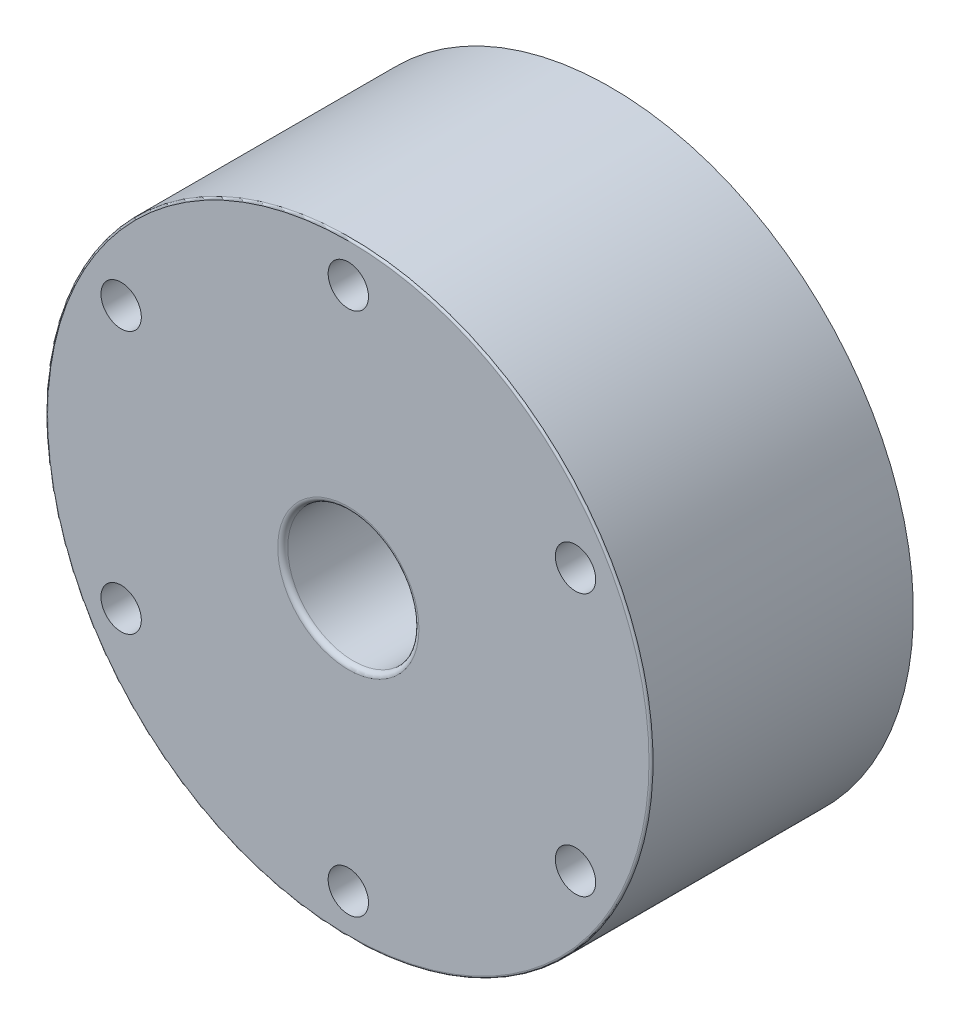
ISO-10303-21;
HEADER;
FILE_DESCRIPTION(('STEP AP214'),'2;1');
FILE_NAME('part.step','',(''),(''),'','','');
FILE_SCHEMA(('AUTOMOTIVE_DESIGN { 1 0 10303 214 1 1 1 1 }'));
ENDSEC;
DATA;
#1=APPLICATION_CONTEXT('core data for automotive mechanical design processes');
#2=APPLICATION_PROTOCOL_DEFINITION('international standard','automotive_design',2000,#1);
#3=PRODUCT_CONTEXT('',#1,'mechanical');
#4=PRODUCT('Part','Part','',(#3));
#5=PRODUCT_RELATED_PRODUCT_CATEGORY('part','',(#4));
#6=PRODUCT_DEFINITION_FORMATION('','',#4);
#7=PRODUCT_DEFINITION_CONTEXT('part definition',#1,'design');
#8=PRODUCT_DEFINITION('design','',#6,#7);
#9=PRODUCT_DEFINITION_SHAPE('','',#8);
#10=(LENGTH_UNIT() NAMED_UNIT(*) SI_UNIT(.MILLI.,.METRE.));
#11=(NAMED_UNIT(*) PLANE_ANGLE_UNIT() SI_UNIT($,.RADIAN.));
#12=(NAMED_UNIT(*) SI_UNIT($,.STERADIAN.) SOLID_ANGLE_UNIT());
#13=UNCERTAINTY_MEASURE_WITH_UNIT(LENGTH_MEASURE(1.E-05),#10,'distance_accuracy_value','');
#14=(GEOMETRIC_REPRESENTATION_CONTEXT(3) GLOBAL_UNCERTAINTY_ASSIGNED_CONTEXT((#13)) GLOBAL_UNIT_ASSIGNED_CONTEXT((#10,
#11,#12)) REPRESENTATION_CONTEXT('',''));
#15=CARTESIAN_POINT('',(0.,0.,0.));
#16=DIRECTION('',(0.,0.,1.));
#17=DIRECTION('',(1.,0.,0.));
#18=AXIS2_PLACEMENT_3D('',#15,#16,#17);
#19=CARTESIAN_POINT('',(0.,0.,0.));
#20=DIRECTION('',(0.,0.,1.));
#21=DIRECTION('',(1.,0.,0.));
#22=AXIS2_PLACEMENT_3D('',#19,#20,#21);
#23=PLANE('',#22);
#24=CARTESIAN_POINT('',(0.,0.,0.));
#25=DIRECTION('',(0.,0.,1.));
#26=DIRECTION('',(1.,0.,0.));
#27=AXIS2_PLACEMENT_3D('',#24,#25,#26);
#28=CIRCLE('',#27,6.5);
#29=CARTESIAN_POINT('',(-6.5,0.,0.));
#30=VERTEX_POINT('',#29);
#31=EDGE_CURVE('E155',#30,#30,#28,.T.);
#32=ORIENTED_EDGE('',*,*,#31,.T.);
#33=EDGE_LOOP('',(#32));
#34=FACE_BOUND('',#33,.T.);
#35=CARTESIAN_POINT('',(0.,0.,0.));
#36=DIRECTION('',(0.,0.,1.));
#37=DIRECTION('',(1.,0.,0.));
#38=AXIS2_PLACEMENT_3D('',#35,#36,#37);
#39=CIRCLE('',#38,30.);
#40=CARTESIAN_POINT('',(-30.,0.,0.));
#41=VERTEX_POINT('',#40);
#42=EDGE_CURVE('E113',#41,#41,#39,.T.);
#43=ORIENTED_EDGE('',*,*,#42,.F.);
#44=EDGE_LOOP('',(#43));
#45=FACE_BOUND('',#44,.T.);
#46=ADVANCED_FACE('F16',(#34,#45),#23,.F.);
#47=CARTESIAN_POINT('',(0.,26.,16.));
#48=DIRECTION('',(0.,0.,1.));
#49=DIRECTION('',(1.,0.,0.));
#50=AXIS2_PLACEMENT_3D('',#47,#48,#49);
#51=PLANE('',#50);
#52=CARTESIAN_POINT('',(0.,26.,16.));
#53=DIRECTION('',(0.,0.,-1.));
#54=DIRECTION('',(1.,0.,0.));
#55=AXIS2_PLACEMENT_3D('',#52,#53,#54);
#56=CIRCLE('',#55,2.);
#57=CARTESIAN_POINT('',(-2.,26.,16.));
#58=VERTEX_POINT('',#57);
#59=EDGE_CURVE('E11',#58,#58,#56,.T.);
#60=ORIENTED_EDGE('',*,*,#59,.F.);
#61=EDGE_LOOP('',(#60));
#62=FACE_BOUND('',#61,.T.);
#63=ADVANCED_FACE('F241',(#62),#51,.T.);
#64=CARTESIAN_POINT('',(0.,26.,26.));
#65=DIRECTION('',(0.,0.,-1.));
#66=DIRECTION('',(1.,0.,0.));
#67=AXIS2_PLACEMENT_3D('',#64,#65,#66);
#68=CYLINDRICAL_SURFACE('',#67,2.);
#69=CARTESIAN_POINT('',(0.,26.,26.));
#70=DIRECTION('',(0.,0.,-1.));
#71=DIRECTION('',(1.,0.,0.));
#72=AXIS2_PLACEMENT_3D('',#69,#70,#71);
#73=CIRCLE('',#72,2.);
#74=CARTESIAN_POINT('',(-2.,26.,26.));
#75=VERTEX_POINT('',#74);
#76=EDGE_CURVE('E117',#75,#75,#73,.T.);
#77=ORIENTED_EDGE('',*,*,#76,.F.);
#78=DIRECTION('',(0.,0.,-1.));
#79=VECTOR('',#78,1.);
#80=CARTESIAN_POINT('',(-2.,26.,26.));
#81=LINE('',#80,#79);
#82=EDGE_CURVE('E27',#75,#58,#81,.T.);
#83=ORIENTED_EDGE('',*,*,#82,.T.);
#84=ORIENTED_EDGE('',*,*,#59,.T.);
#85=ORIENTED_EDGE('',*,*,#82,.F.);
#86=EDGE_LOOP('',(#77,#83,#84,#85));
#87=FACE_BOUND('',#86,.T.);
#88=ADVANCED_FACE('F18',(#87),#68,.F.);
#89=CARTESIAN_POINT('',(22.5166604983954,-13.,16.));
#90=DIRECTION('',(0.,0.,1.));
#91=DIRECTION('',(1.,0.,0.));
#92=AXIS2_PLACEMENT_3D('',#89,#90,#91);
#93=PLANE('',#92);
#94=CARTESIAN_POINT('',(22.5166604983954,-13.,16.));
#95=DIRECTION('',(0.,0.,-1.));
#96=DIRECTION('',(1.,0.,0.));
#97=AXIS2_PLACEMENT_3D('',#94,#95,#96);
#98=CIRCLE('',#97,2.);
#99=CARTESIAN_POINT('',(20.5166604983954,-13.,16.));
#100=VERTEX_POINT('',#99);
#101=EDGE_CURVE('E126',#100,#100,#98,.T.);
#102=ORIENTED_EDGE('',*,*,#101,.F.);
#103=EDGE_LOOP('',(#102));
#104=FACE_BOUND('',#103,.T.);
#105=ADVANCED_FACE('F265',(#104),#93,.T.);
#106=CARTESIAN_POINT('',(22.5166604983954,-13.,26.));
#107=DIRECTION('',(0.,0.,-1.));
#108=DIRECTION('',(1.,0.,0.));
#109=AXIS2_PLACEMENT_3D('',#106,#107,#108);
#110=CYLINDRICAL_SURFACE('',#109,2.);
#111=CARTESIAN_POINT('',(22.5166604983954,-13.,26.));
#112=DIRECTION('',(0.,0.,-1.));
#113=DIRECTION('',(1.,0.,0.));
#114=AXIS2_PLACEMENT_3D('',#111,#112,#113);
#115=CIRCLE('',#114,2.);
#116=CARTESIAN_POINT('',(20.5166604983954,-13.,26.));
#117=VERTEX_POINT('',#116);
#118=EDGE_CURVE('E172',#117,#117,#115,.T.);
#119=ORIENTED_EDGE('',*,*,#118,.F.);
#120=DIRECTION('',(0.,0.,-1.));
#121=VECTOR('',#120,1.);
#122=CARTESIAN_POINT('',(20.5166604983954,-13.,26.));
#123=LINE('',#122,#121);
#124=EDGE_CURVE('E123',#117,#100,#123,.T.);
#125=ORIENTED_EDGE('',*,*,#124,.T.);
#126=ORIENTED_EDGE('',*,*,#101,.T.);
#127=ORIENTED_EDGE('',*,*,#124,.F.);
#128=EDGE_LOOP('',(#119,#125,#126,#127));
#129=FACE_BOUND('',#128,.T.);
#130=ADVANCED_FACE('F236',(#129),#110,.F.);
#131=CARTESIAN_POINT('',(0.,-26.,16.));
#132=DIRECTION('',(0.,0.,1.));
#133=DIRECTION('',(1.,0.,0.));
#134=AXIS2_PLACEMENT_3D('',#131,#132,#133);
#135=PLANE('',#134);
#136=CARTESIAN_POINT('',(0.,-26.,16.));
#137=DIRECTION('',(0.,0.,-1.));
#138=DIRECTION('',(1.,0.,0.));
#139=AXIS2_PLACEMENT_3D('',#136,#137,#138);
#140=CIRCLE('',#139,2.);
#141=CARTESIAN_POINT('',(-2.,-26.,16.));
#142=VERTEX_POINT('',#141);
#143=EDGE_CURVE('E127',#142,#142,#140,.T.);
#144=ORIENTED_EDGE('',*,*,#143,.F.);
#145=EDGE_LOOP('',(#144));
#146=FACE_BOUND('',#145,.T.);
#147=ADVANCED_FACE('F227',(#146),#135,.T.);
#148=CARTESIAN_POINT('',(0.,-26.,26.));
#149=DIRECTION('',(0.,0.,-1.));
#150=DIRECTION('',(1.,0.,0.));
#151=AXIS2_PLACEMENT_3D('',#148,#149,#150);
#152=CYLINDRICAL_SURFACE('',#151,2.);
#153=CARTESIAN_POINT('',(0.,-26.,26.));
#154=DIRECTION('',(0.,0.,-1.));
#155=DIRECTION('',(1.,0.,0.));
#156=AXIS2_PLACEMENT_3D('',#153,#154,#155);
#157=CIRCLE('',#156,2.);
#158=CARTESIAN_POINT('',(-2.,-26.,26.));
#159=VERTEX_POINT('',#158);
#160=EDGE_CURVE('E168',#159,#159,#157,.T.);
#161=ORIENTED_EDGE('',*,*,#160,.F.);
#162=DIRECTION('',(0.,0.,-1.));
#163=VECTOR('',#162,1.);
#164=CARTESIAN_POINT('',(-2.,-26.,26.));
#165=LINE('',#164,#163);
#166=EDGE_CURVE('E135',#159,#142,#165,.T.);
#167=ORIENTED_EDGE('',*,*,#166,.T.);
#168=ORIENTED_EDGE('',*,*,#143,.T.);
#169=ORIENTED_EDGE('',*,*,#166,.F.);
#170=EDGE_LOOP('',(#161,#167,#168,#169));
#171=FACE_BOUND('',#170,.T.);
#172=ADVANCED_FACE('F224',(#171),#152,.F.);
#173=CARTESIAN_POINT('',(-22.5166604983954,13.,16.));
#174=DIRECTION('',(0.,0.,1.));
#175=DIRECTION('',(1.,0.,0.));
#176=AXIS2_PLACEMENT_3D('',#173,#174,#175);
#177=PLANE('',#176);
#178=CARTESIAN_POINT('',(-22.5166604983954,13.,16.));
#179=DIRECTION('',(0.,0.,-1.));
#180=DIRECTION('',(1.,0.,0.));
#181=AXIS2_PLACEMENT_3D('',#178,#179,#180);
#182=CIRCLE('',#181,2.);
#183=CARTESIAN_POINT('',(-24.5166604983954,13.,16.));
#184=VERTEX_POINT('',#183);
#185=EDGE_CURVE('E143',#184,#184,#182,.T.);
#186=ORIENTED_EDGE('',*,*,#185,.F.);
#187=EDGE_LOOP('',(#186));
#188=FACE_BOUND('',#187,.T.);
#189=ADVANCED_FACE('F226',(#188),#177,.T.);
#190=CARTESIAN_POINT('',(-22.5166604983954,13.,26.));
#191=DIRECTION('',(0.,0.,-1.));
#192=DIRECTION('',(1.,0.,0.));
#193=AXIS2_PLACEMENT_3D('',#190,#191,#192);
#194=CYLINDRICAL_SURFACE('',#193,2.);
#195=CARTESIAN_POINT('',(-22.5166604983954,13.,26.));
#196=DIRECTION('',(0.,0.,-1.));
#197=DIRECTION('',(1.,0.,0.));
#198=AXIS2_PLACEMENT_3D('',#195,#196,#197);
#199=CIRCLE('',#198,2.);
#200=CARTESIAN_POINT('',(-24.5166604983954,13.,26.));
#201=VERTEX_POINT('',#200);
#202=EDGE_CURVE('E164',#201,#201,#199,.T.);
#203=ORIENTED_EDGE('',*,*,#202,.F.);
#204=DIRECTION('',(0.,0.,-1.));
#205=VECTOR('',#204,1.);
#206=CARTESIAN_POINT('',(-24.5166604983954,13.,26.));
#207=LINE('',#206,#205);
#208=EDGE_CURVE('E193',#201,#184,#207,.T.);
#209=ORIENTED_EDGE('',*,*,#208,.T.);
#210=ORIENTED_EDGE('',*,*,#185,.T.);
#211=ORIENTED_EDGE('',*,*,#208,.F.);
#212=EDGE_LOOP('',(#203,#209,#210,#211));
#213=FACE_BOUND('',#212,.T.);
#214=ADVANCED_FACE('F191',(#213),#194,.F.);
#215=CARTESIAN_POINT('',(22.5166604983954,13.,16.));
#216=DIRECTION('',(0.,0.,1.));
#217=DIRECTION('',(1.,0.,0.));
#218=AXIS2_PLACEMENT_3D('',#215,#216,#217);
#219=PLANE('',#218);
#220=CARTESIAN_POINT('',(22.5166604983954,13.,16.));
#221=DIRECTION('',(0.,0.,-1.));
#222=DIRECTION('',(1.,0.,0.));
#223=AXIS2_PLACEMENT_3D('',#220,#221,#222);
#224=CIRCLE('',#223,2.);
#225=CARTESIAN_POINT('',(20.5166604983954,13.,16.));
#226=VERTEX_POINT('',#225);
#227=EDGE_CURVE('E110',#226,#226,#224,.T.);
#228=ORIENTED_EDGE('',*,*,#227,.F.);
#229=EDGE_LOOP('',(#228));
#230=FACE_BOUND('',#229,.T.);
#231=ADVANCED_FACE('F257',(#230),#219,.T.);
#232=CARTESIAN_POINT('',(22.5166604983954,13.,26.));
#233=DIRECTION('',(0.,0.,-1.));
#234=DIRECTION('',(1.,0.,0.));
#235=AXIS2_PLACEMENT_3D('',#232,#233,#234);
#236=CYLINDRICAL_SURFACE('',#235,2.);
#237=CARTESIAN_POINT('',(22.5166604983954,13.,26.));
#238=DIRECTION('',(0.,0.,-1.));
#239=DIRECTION('',(1.,0.,0.));
#240=AXIS2_PLACEMENT_3D('',#237,#238,#239);
#241=CIRCLE('',#240,2.);
#242=CARTESIAN_POINT('',(20.5166604983954,13.,26.));
#243=VERTEX_POINT('',#242);
#244=EDGE_CURVE('E160',#243,#243,#241,.T.);
#245=ORIENTED_EDGE('',*,*,#244,.F.);
#246=DIRECTION('',(0.,0.,-1.));
#247=VECTOR('',#246,1.);
#248=CARTESIAN_POINT('',(20.5166604983954,13.,26.));
#249=LINE('',#248,#247);
#250=EDGE_CURVE('E103',#243,#226,#249,.T.);
#251=ORIENTED_EDGE('',*,*,#250,.T.);
#252=ORIENTED_EDGE('',*,*,#227,.T.);
#253=ORIENTED_EDGE('',*,*,#250,.F.);
#254=EDGE_LOOP('',(#245,#251,#252,#253));
#255=FACE_BOUND('',#254,.T.);
#256=ADVANCED_FACE('F254',(#255),#236,.F.);
#257=CARTESIAN_POINT('',(-22.5166604983954,-13.,16.));
#258=DIRECTION('',(0.,0.,1.));
#259=DIRECTION('',(1.,0.,0.));
#260=AXIS2_PLACEMENT_3D('',#257,#258,#259);
#261=PLANE('',#260);
#262=CARTESIAN_POINT('',(-22.5166604983954,-13.,16.));
#263=DIRECTION('',(0.,0.,-1.));
#264=DIRECTION('',(1.,0.,0.));
#265=AXIS2_PLACEMENT_3D('',#262,#263,#264);
#266=CIRCLE('',#265,2.);
#267=CARTESIAN_POINT('',(-24.5166604983954,-13.,16.));
#268=VERTEX_POINT('',#267);
#269=EDGE_CURVE('E96',#268,#268,#266,.T.);
#270=ORIENTED_EDGE('',*,*,#269,.F.);
#271=EDGE_LOOP('',(#270));
#272=FACE_BOUND('',#271,.T.);
#273=ADVANCED_FACE('F251',(#272),#261,.T.);
#274=CARTESIAN_POINT('',(-22.5166604983954,-13.,26.));
#275=DIRECTION('',(0.,0.,-1.));
#276=DIRECTION('',(1.,0.,0.));
#277=AXIS2_PLACEMENT_3D('',#274,#275,#276);
#278=CYLINDRICAL_SURFACE('',#277,2.);
#279=CARTESIAN_POINT('',(-22.5166604983954,-13.,26.));
#280=DIRECTION('',(0.,0.,-1.));
#281=DIRECTION('',(1.,0.,0.));
#282=AXIS2_PLACEMENT_3D('',#279,#280,#281);
#283=CIRCLE('',#282,2.);
#284=CARTESIAN_POINT('',(-24.5166604983954,-13.,26.));
#285=VERTEX_POINT('',#284);
#286=EDGE_CURVE('E121',#285,#285,#283,.T.);
#287=ORIENTED_EDGE('',*,*,#286,.F.);
#288=DIRECTION('',(0.,0.,-1.));
#289=VECTOR('',#288,1.);
#290=CARTESIAN_POINT('',(-24.5166604983954,-13.,26.));
#291=LINE('',#290,#289);
#292=EDGE_CURVE('E99',#285,#268,#291,.T.);
#293=ORIENTED_EDGE('',*,*,#292,.T.);
#294=ORIENTED_EDGE('',*,*,#269,.T.);
#295=ORIENTED_EDGE('',*,*,#292,.F.);
#296=EDGE_LOOP('',(#287,#293,#294,#295));
#297=FACE_BOUND('',#296,.T.);
#298=ADVANCED_FACE('F98',(#297),#278,.F.);
#299=CARTESIAN_POINT('',(0.,0.,0.));
#300=DIRECTION('',(0.,0.,1.));
#301=DIRECTION('',(1.,0.,0.));
#302=AXIS2_PLACEMENT_3D('',#299,#300,#301);
#303=CYLINDRICAL_SURFACE('',#302,30.);
#304=CARTESIAN_POINT('',(0.,0.,25.8));
#305=DIRECTION('',(0.,0.,1.));
#306=DIRECTION('',(-1.,0.,0.));
#307=AXIS2_PLACEMENT_3D('',#304,#305,#306);
#308=CIRCLE('',#307,30.);
#309=CARTESIAN_POINT('',(-30.,0.,25.8));
#310=VERTEX_POINT('',#309);
#311=EDGE_CURVE('E20',#310,#310,#308,.T.);
#312=ORIENTED_EDGE('',*,*,#311,.F.);
#313=DIRECTION('',(0.,0.,-1.));
#314=VECTOR('',#313,1.);
#315=CARTESIAN_POINT('',(-30.,0.,0.));
#316=LINE('',#315,#314);
#317=EDGE_CURVE('E166',#310,#41,#316,.T.);
#318=ORIENTED_EDGE('',*,*,#317,.T.);
#319=ORIENTED_EDGE('',*,*,#42,.T.);
#320=ORIENTED_EDGE('',*,*,#317,.F.);
#321=EDGE_LOOP('',(#312,#318,#319,#320));
#322=FACE_BOUND('',#321,.T.);
#323=ADVANCED_FACE('F273',(#322),#303,.T.);
#324=CARTESIAN_POINT('',(0.,0.,25.8));
#325=DIRECTION('',(0.,0.,1.));
#326=DIRECTION('',(1.,0.,0.));
#327=AXIS2_PLACEMENT_3D('',#324,#325,#326);
#328=TOROIDAL_SURFACE('',#327,29.8,0.2);
#329=CARTESIAN_POINT('',(0.,0.,26.));
#330=DIRECTION('',(0.,0.,-1.));
#331=DIRECTION('',(-1.,0.,0.));
#332=AXIS2_PLACEMENT_3D('',#329,#330,#331);
#333=CIRCLE('',#332,29.8);
#334=CARTESIAN_POINT('',(-29.8,0.,26.));
#335=VERTEX_POINT('',#334);
#336=EDGE_CURVE('E119',#335,#335,#333,.T.);
#337=ORIENTED_EDGE('',*,*,#336,.T.);
#338=CARTESIAN_POINT('',(-29.8,0.,25.8));
#339=DIRECTION('',(0.,-1.,0.));
#340=DIRECTION('',(-1.,0.,0.));
#341=AXIS2_PLACEMENT_3D('',#338,#339,#340);
#342=CIRCLE('',#341,0.2);
#343=EDGE_CURVE('E156',#335,#310,#342,.T.);
#344=ORIENTED_EDGE('',*,*,#343,.T.);
#345=ORIENTED_EDGE('',*,*,#311,.T.);
#346=ORIENTED_EDGE('',*,*,#343,.F.);
#347=EDGE_LOOP('',(#337,#344,#345,#346));
#348=FACE_BOUND('',#347,.T.);
#349=ADVANCED_FACE('F269',(#348),#328,.T.);
#350=CARTESIAN_POINT('',(0.,0.,26.));
#351=DIRECTION('',(0.,0.,-1.));
#352=DIRECTION('',(1.,0.,0.));
#353=AXIS2_PLACEMENT_3D('',#350,#351,#352);
#354=CYLINDRICAL_SURFACE('',#353,6.5);
#355=CARTESIAN_POINT('',(0.,0.,25.5));
#356=DIRECTION('',(0.,0.,-1.));
#357=DIRECTION('',(-1.,0.,0.));
#358=AXIS2_PLACEMENT_3D('',#355,#356,#357);
#359=CIRCLE('',#358,6.5);
#360=CARTESIAN_POINT('',(6.5,0.,25.5));
#361=VERTEX_POINT('',#360);
#362=CARTESIAN_POINT('',(-6.5,0.,25.5));
#363=VERTEX_POINT('',#362);
#364=EDGE_CURVE('E147',#361,#363,#359,.T.);
#365=ORIENTED_EDGE('',*,*,#364,.F.);
#366=CARTESIAN_POINT('',(0.,0.,25.5));
#367=DIRECTION('',(0.,0.,-1.));
#368=DIRECTION('',(-1.,0.,0.));
#369=AXIS2_PLACEMENT_3D('',#366,#367,#368);
#370=CIRCLE('',#369,6.5);
#371=EDGE_CURVE('E122',#363,#361,#370,.T.);
#372=ORIENTED_EDGE('',*,*,#371,.F.);
#373=DIRECTION('',(0.,0.,-1.));
#374=VECTOR('',#373,1.);
#375=CARTESIAN_POINT('',(-6.5,0.,26.));
#376=LINE('',#375,#374);
#377=EDGE_CURVE('E151',#363,#30,#376,.T.);
#378=ORIENTED_EDGE('',*,*,#377,.T.);
#379=ORIENTED_EDGE('',*,*,#31,.F.);
#380=ORIENTED_EDGE('',*,*,#377,.F.);
#381=EDGE_LOOP('',(#365,#372,#378,#379,#380));
#382=FACE_BOUND('',#381,.T.);
#383=ADVANCED_FACE('F219',(#382),#354,.F.);
#384=CARTESIAN_POINT('',(0.,0.,26.));
#385=DIRECTION('',(0.,0.,1.));
#386=DIRECTION('',(1.,0.,0.));
#387=AXIS2_PLACEMENT_3D('',#384,#385,#386);
#388=PLANE('',#387);
#389=CARTESIAN_POINT('',(0.,0.,26.));
#390=DIRECTION('',(0.,0.,1.));
#391=DIRECTION('',(-1.,0.,0.));
#392=AXIS2_PLACEMENT_3D('',#389,#390,#391);
#393=CIRCLE('',#392,7.);
#394=CARTESIAN_POINT('',(7.,0.,26.));
#395=VERTEX_POINT('',#394);
#396=EDGE_CURVE('E176',#395,#395,#393,.T.);
#397=ORIENTED_EDGE('',*,*,#396,.F.);
#398=EDGE_LOOP('',(#397));
#399=FACE_BOUND('',#398,.T.);
#400=ORIENTED_EDGE('',*,*,#76,.T.);
#401=EDGE_LOOP('',(#400));
#402=FACE_BOUND('',#401,.T.);
#403=ORIENTED_EDGE('',*,*,#118,.T.);
#404=EDGE_LOOP('',(#403));
#405=FACE_BOUND('',#404,.T.);
#406=ORIENTED_EDGE('',*,*,#160,.T.);
#407=EDGE_LOOP('',(#406));
#408=FACE_BOUND('',#407,.T.);
#409=ORIENTED_EDGE('',*,*,#202,.T.);
#410=EDGE_LOOP('',(#409));
#411=FACE_BOUND('',#410,.T.);
#412=ORIENTED_EDGE('',*,*,#244,.T.);
#413=EDGE_LOOP('',(#412));
#414=FACE_BOUND('',#413,.T.);
#415=ORIENTED_EDGE('',*,*,#286,.T.);
#416=EDGE_LOOP('',(#415));
#417=FACE_BOUND('',#416,.T.);
#418=ORIENTED_EDGE('',*,*,#336,.F.);
#419=EDGE_LOOP('',(#418));
#420=FACE_BOUND('',#419,.T.);
#421=ADVANCED_FACE('F187',(#399,#402,#405,#408,#411,#414,#417,#420),#388,.T.);
#422=CARTESIAN_POINT('',(0.,0.,25.5));
#423=DIRECTION('',(0.,0.,-1.));
#424=DIRECTION('',(-1.,0.,0.));
#425=AXIS2_PLACEMENT_3D('',#422,#423,#424);
#426=TOROIDAL_SURFACE('',#425,7.,0.5);
#427=ORIENTED_EDGE('',*,*,#396,.T.);
#428=CARTESIAN_POINT('',(7.,0.,25.5));
#429=DIRECTION('',(0.,-1.,0.));
#430=DIRECTION('',(1.,0.,0.));
#431=AXIS2_PLACEMENT_3D('',#428,#429,#430);
#432=CIRCLE('',#431,0.5);
#433=EDGE_CURVE('E150',#395,#361,#432,.T.);
#434=ORIENTED_EDGE('',*,*,#433,.T.);
#435=ORIENTED_EDGE('',*,*,#364,.T.);
#436=ORIENTED_EDGE('',*,*,#371,.T.);
#437=ORIENTED_EDGE('',*,*,#433,.F.);
#438=EDGE_LOOP('',(#427,#434,#435,#436,#437));
#439=FACE_BOUND('',#438,.T.);
#440=ADVANCED_FACE('F218',(#439),#426,.T.);
#441=CLOSED_SHELL('',(#46,#63,#88,#105,#130,#147,#172,#189,#214,#231,#256,#273,#298,#323,#349,
#383,#421,#440));
#442=MANIFOLD_SOLID_BREP('B1',#441);
#443=ADVANCED_BREP_SHAPE_REPRESENTATION('',(#18,#442),#14);
#444=SHAPE_DEFINITION_REPRESENTATION(#9,#443);
ENDSEC;
END-ISO-10303-21;
